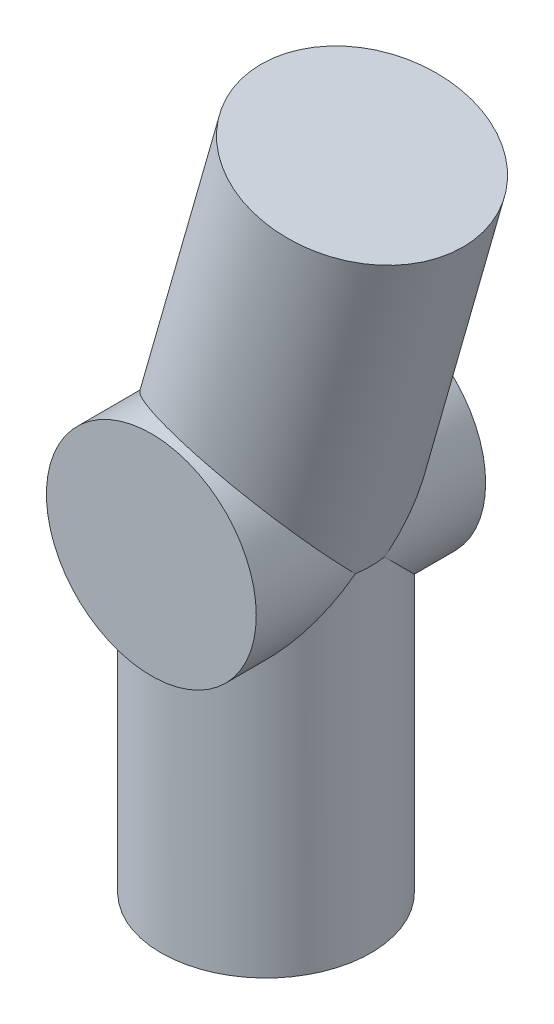
ISO-10303-21;
HEADER;
FILE_DESCRIPTION(('STEP AP214'),'2;1');
FILE_NAME('part.step','',(''),(''),'','','');
FILE_SCHEMA(('AUTOMOTIVE_DESIGN { 1 0 10303 214 1 1 1 1 }'));
ENDSEC;
DATA;
#1=APPLICATION_CONTEXT('core data for automotive mechanical design processes');
#2=APPLICATION_PROTOCOL_DEFINITION('international standard','automotive_design',2000,#1);
#3=PRODUCT_CONTEXT('',#1,'mechanical');
#4=PRODUCT('Part','Part','',(#3));
#5=PRODUCT_RELATED_PRODUCT_CATEGORY('part','',(#4));
#6=PRODUCT_DEFINITION_FORMATION('','',#4);
#7=PRODUCT_DEFINITION_CONTEXT('part definition',#1,'design');
#8=PRODUCT_DEFINITION('design','',#6,#7);
#9=PRODUCT_DEFINITION_SHAPE('','',#8);
#10=(LENGTH_UNIT() NAMED_UNIT(*) SI_UNIT(.MILLI.,.METRE.));
#11=(NAMED_UNIT(*) PLANE_ANGLE_UNIT() SI_UNIT($,.RADIAN.));
#12=(NAMED_UNIT(*) SI_UNIT($,.STERADIAN.) SOLID_ANGLE_UNIT());
#13=UNCERTAINTY_MEASURE_WITH_UNIT(LENGTH_MEASURE(1.E-05),#10,'distance_accuracy_value','');
#14=(GEOMETRIC_REPRESENTATION_CONTEXT(3) GLOBAL_UNCERTAINTY_ASSIGNED_CONTEXT((#13)) GLOBAL_UNIT_ASSIGNED_CONTEXT((#10,
#11,#12)) REPRESENTATION_CONTEXT('',''));
#15=CARTESIAN_POINT('',(0.,0.,0.));
#16=DIRECTION('',(0.,0.,1.));
#17=DIRECTION('',(1.,0.,0.));
#18=AXIS2_PLACEMENT_3D('',#15,#16,#17);
#19=CARTESIAN_POINT('',(0.,0.,7.87));
#20=DIRECTION('',(0.,0.,-1.));
#21=DIRECTION('',(-1.,0.,0.));
#22=AXIS2_PLACEMENT_3D('',#19,#20,#21);
#23=CYLINDRICAL_SURFACE('',#22,3.6);
#24=CARTESIAN_POINT('',(0.,0.,0.));
#25=DIRECTION('',(0.,0.,1.));
#26=DIRECTION('',(1.,0.,0.));
#27=AXIS2_PLACEMENT_3D('',#24,#25,#26);
#28=CIRCLE('',#27,3.6);
#29=CARTESIAN_POINT('',(3.6,0.,0.));
#30=VERTEX_POINT('',#29);
#31=EDGE_CURVE('E197',#30,#30,#28,.T.);
#32=ORIENTED_EDGE('',*,*,#31,.T.);
#33=EDGE_LOOP('',(#32));
#34=FACE_BOUND('',#33,.T.);
#35=CARTESIAN_POINT('',(0.,0.,7.87));
#36=DIRECTION('',(0.,0.,1.));
#37=DIRECTION('',(1.,0.,0.));
#38=AXIS2_PLACEMENT_3D('',#35,#36,#37);
#39=CIRCLE('',#38,3.6);
#40=CARTESIAN_POINT('',(3.6,0.,7.87));
#41=VERTEX_POINT('',#40);
#42=EDGE_CURVE('E165',#41,#41,#39,.T.);
#43=ORIENTED_EDGE('',*,*,#42,.F.);
#44=EDGE_LOOP('',(#43));
#45=FACE_BOUND('',#44,.T.);
#46=CARTESIAN_POINT('',(0.,0.,3.935));
#47=DIRECTION('',(0.194074470073138,0.679952277785604,-0.707106781186547));
#48=DIRECTION('',(0.194074470073138,0.679952277785604,0.707106781186547));
#49=AXIS2_PLACEMENT_3D('',#46,#47,#48);
#50=ELLIPSE('',#49,5.09116882454314,3.6);
#51=CARTESIAN_POINT('',(3.56527043994008,-0.498845356888758,4.43384535688876));
#52=VERTEX_POINT('',#51);
#53=CARTESIAN_POINT('',(-3.46175183883916,0.98806589167609,3.935));
#54=VERTEX_POINT('',#53);
#55=EDGE_CURVE('E171',#52,#54,#50,.F.);
#56=ORIENTED_EDGE('',*,*,#55,.T.);
#57=CARTESIAN_POINT('',(0.,0.,3.935));
#58=DIRECTION('',(0.194074470073138,0.679952277785604,0.707106781186547));
#59=DIRECTION('',(0.194074470073138,0.679952277785604,-0.707106781186547));
#60=AXIS2_PLACEMENT_3D('',#57,#58,#59);
#61=ELLIPSE('',#60,5.09116882454314,3.6);
#62=CARTESIAN_POINT('',(3.56527043994008,-0.498845356888757,3.43615464311118));
#63=VERTEX_POINT('',#62);
#64=EDGE_CURVE('E190',#54,#63,#61,.F.);
#65=ORIENTED_EDGE('',*,*,#64,.T.);
#66=CARTESIAN_POINT('',(0.,0.,3.935));
#67=DIRECTION('',(0.,-0.707106781186547,0.707106781186548));
#68=DIRECTION('',(0.,-0.707106781186547,-0.707106781186548));
#69=AXIS2_PLACEMENT_3D('',#66,#67,#68);
#70=ELLIPSE('',#69,5.09116882454314,3.6);
#71=CARTESIAN_POINT('',(-3.6,0.,3.935));
#72=VERTEX_POINT('',#71);
#73=EDGE_CURVE('E185',#63,#72,#70,.F.);
#74=ORIENTED_EDGE('',*,*,#73,.T.);
#75=CARTESIAN_POINT('',(0.,0.,3.935));
#76=DIRECTION('',(0.,-0.707106781186547,-0.707106781186548));
#77=DIRECTION('',(0.,-0.707106781186547,0.707106781186548));
#78=AXIS2_PLACEMENT_3D('',#75,#76,#77);
#79=ELLIPSE('',#78,5.09116882454314,3.6);
#80=EDGE_CURVE('E183',#72,#52,#79,.F.);
#81=ORIENTED_EDGE('',*,*,#80,.T.);
#82=EDGE_LOOP('',(#56,#65,#74,#81));
#83=FACE_BOUND('',#82,.T.);
#84=ADVANCED_FACE('F160',(#34,#45,#83),#23,.T.);
#85=CARTESIAN_POINT('',(0.,3.601,3.935));
#86=DIRECTION('',(0.,-1.,0.));
#87=DIRECTION('',(0.,0.,-1.));
#88=AXIS2_PLACEMENT_3D('',#85,#86,#87);
#89=CYLINDRICAL_SURFACE('',#88,3.6);
#90=CARTESIAN_POINT('',(0.,-12.,3.935));
#91=DIRECTION('',(0.,1.,0.));
#92=DIRECTION('',(0.,0.,1.));
#93=AXIS2_PLACEMENT_3D('',#90,#91,#92);
#94=CIRCLE('',#93,3.6);
#95=CARTESIAN_POINT('',(0.,-12.,7.535));
#96=VERTEX_POINT('',#95);
#97=EDGE_CURVE('E184',#96,#96,#94,.T.);
#98=ORIENTED_EDGE('',*,*,#97,.T.);
#99=EDGE_LOOP('',(#98));
#100=FACE_BOUND('',#99,.T.);
#101=CARTESIAN_POINT('',(0.,0.,3.935));
#102=DIRECTION('',(-0.138568154691331,-0.990352899983354,0.));
#103=DIRECTION('',(0.990352899983354,-0.13856815469133,0.));
#104=AXIS2_PLACEMENT_3D('',#101,#102,#103);
#105=ELLIPSE('',#104,3.63506786324401,3.6);
#106=EDGE_CURVE('E13',#52,#63,#105,.F.);
#107=ORIENTED_EDGE('',*,*,#106,.F.);
#108=ORIENTED_EDGE('',*,*,#80,.F.);
#109=ORIENTED_EDGE('',*,*,#73,.F.);
#110=EDGE_LOOP('',(#107,#108,#109));
#111=FACE_BOUND('',#110,.T.);
#112=ADVANCED_FACE('F182',(#100,#111),#89,.T.);
#113=CARTESIAN_POINT('',(0.,0.,0.));
#114=DIRECTION('',(0.,0.,1.));
#115=DIRECTION('',(1.,0.,0.));
#116=AXIS2_PLACEMENT_3D('',#113,#114,#115);
#117=PLANE('',#116);
#118=ORIENTED_EDGE('',*,*,#31,.F.);
#119=EDGE_LOOP('',(#118));
#120=FACE_BOUND('',#119,.T.);
#121=ADVANCED_FACE('F210',(#120),#117,.F.);
#122=CARTESIAN_POINT('',(0.,0.,7.87));
#123=DIRECTION('',(0.,0.,1.));
#124=DIRECTION('',(1.,0.,0.));
#125=AXIS2_PLACEMENT_3D('',#122,#123,#124);
#126=PLANE('',#125);
#127=ORIENTED_EDGE('',*,*,#42,.T.);
#128=EDGE_LOOP('',(#127));
#129=FACE_BOUND('',#128,.T.);
#130=ADVANCED_FACE('F209',(#129),#126,.T.);
#131=CARTESIAN_POINT('',(0.,-12.,0.));
#132=DIRECTION('',(0.,1.,0.));
#133=DIRECTION('',(0.,0.,1.));
#134=AXIS2_PLACEMENT_3D('',#131,#132,#133);
#135=PLANE('',#134);
#136=ORIENTED_EDGE('',*,*,#97,.F.);
#137=EDGE_LOOP('',(#136));
#138=FACE_BOUND('',#137,.T.);
#139=ADVANCED_FACE('F212',(#138),#135,.F.);
#140=CARTESIAN_POINT('',(-3.4385996037522,-12.0473529160371,3.935));
#141=DIRECTION('',(0.274462747687803,0.961597733010879,0.));
#142=DIRECTION('',(-0.961597733010879,0.274462747687803,0.));
#143=AXIS2_PLACEMENT_3D('',#140,#141,#142);
#144=CYLINDRICAL_SURFACE('',#143,3.6);
#145=ORIENTED_EDGE('',*,*,#55,.F.);
#146=ORIENTED_EDGE('',*,*,#106,.T.);
#147=ORIENTED_EDGE('',*,*,#64,.F.);
#148=EDGE_LOOP('',(#145,#146,#147));
#149=FACE_BOUND('',#148,.T.);
#150=CARTESIAN_POINT('',(3.29355297225363,11.5391727961305,3.935));
#151=DIRECTION('',(-0.274462747687803,-0.961597733010879,0.));
#152=DIRECTION('',(0.961597733010879,-0.274462747687803,0.));
#153=AXIS2_PLACEMENT_3D('',#150,#151,#152);
#154=CIRCLE('',#153,3.6);
#155=CARTESIAN_POINT('',(6.7553048110928,10.5511069044545,3.935));
#156=VERTEX_POINT('',#155);
#157=EDGE_CURVE('E194',#156,#156,#154,.T.);
#158=ORIENTED_EDGE('',*,*,#157,.T.);
#159=EDGE_LOOP('',(#158));
#160=FACE_BOUND('',#159,.T.);
#161=ADVANCED_FACE('F188',(#149,#160),#144,.T.);
#162=CARTESIAN_POINT('',(3.29355297225363,11.5391727961305,0.));
#163=DIRECTION('',(-0.274462747687803,-0.961597733010879,0.));
#164=DIRECTION('',(0.961597733010879,-0.274462747687803,0.));
#165=AXIS2_PLACEMENT_3D('',#162,#163,#164);
#166=PLANE('',#165);
#167=ORIENTED_EDGE('',*,*,#157,.F.);
#168=EDGE_LOOP('',(#167));
#169=FACE_BOUND('',#168,.T.);
#170=ADVANCED_FACE('F240',(#169),#166,.F.);
#171=CLOSED_SHELL('',(#84,#112,#121,#130,#139,#161,#170));
#172=MANIFOLD_SOLID_BREP('B2',#171);
#173=ADVANCED_BREP_SHAPE_REPRESENTATION('',(#18,#172),#14);
#174=SHAPE_DEFINITION_REPRESENTATION(#9,#173);
ENDSEC;
END-ISO-10303-21;
